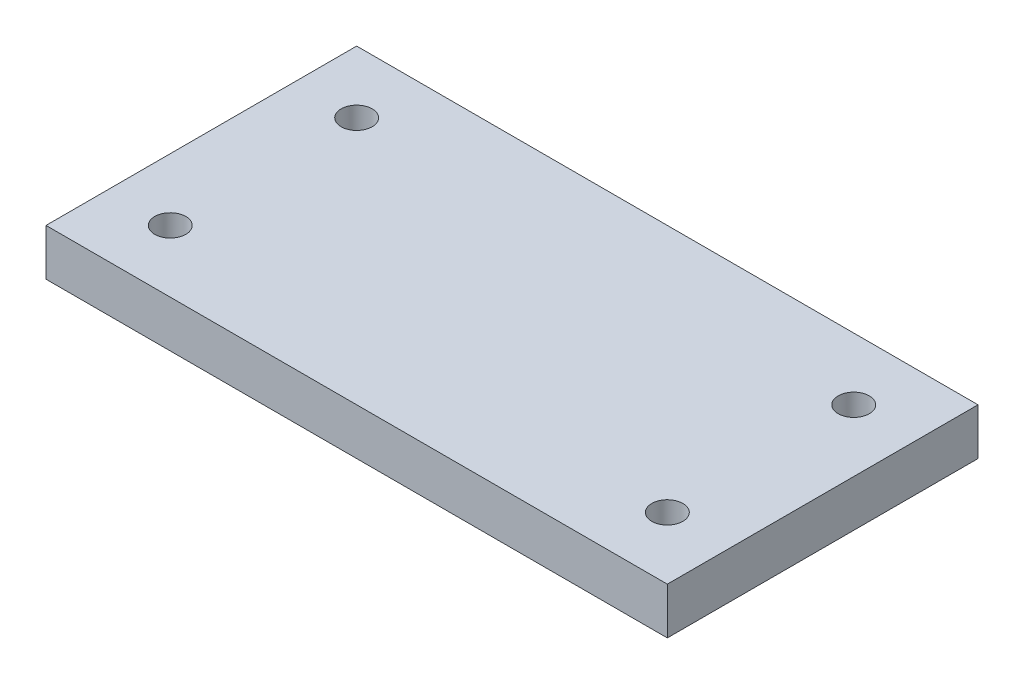
ISO-10303-21;
HEADER;
FILE_DESCRIPTION(('STEP AP214'),'2;1');
FILE_NAME('part.step','',(''),(''),'','','');
FILE_SCHEMA(('AUTOMOTIVE_DESIGN { 1 0 10303 214 1 1 1 1 }'));
ENDSEC;
DATA;
#1=APPLICATION_CONTEXT('core data for automotive mechanical design processes');
#2=APPLICATION_PROTOCOL_DEFINITION('international standard','automotive_design',2000,#1);
#3=PRODUCT_CONTEXT('',#1,'mechanical');
#4=PRODUCT('Part','Part','',(#3));
#5=PRODUCT_RELATED_PRODUCT_CATEGORY('part','',(#4));
#6=PRODUCT_DEFINITION_FORMATION('','',#4);
#7=PRODUCT_DEFINITION_CONTEXT('part definition',#1,'design');
#8=PRODUCT_DEFINITION('design','',#6,#7);
#9=PRODUCT_DEFINITION_SHAPE('','',#8);
#10=(LENGTH_UNIT() NAMED_UNIT(*) SI_UNIT(.MILLI.,.METRE.));
#11=(NAMED_UNIT(*) PLANE_ANGLE_UNIT() SI_UNIT($,.RADIAN.));
#12=(NAMED_UNIT(*) SI_UNIT($,.STERADIAN.) SOLID_ANGLE_UNIT());
#13=UNCERTAINTY_MEASURE_WITH_UNIT(LENGTH_MEASURE(1.E-05),#10,'distance_accuracy_value','');
#14=(GEOMETRIC_REPRESENTATION_CONTEXT(3) GLOBAL_UNCERTAINTY_ASSIGNED_CONTEXT((#13)) GLOBAL_UNIT_ASSIGNED_CONTEXT((#10,
#11,#12)) REPRESENTATION_CONTEXT('',''));
#15=CARTESIAN_POINT('',(0.,0.,0.));
#16=DIRECTION('',(0.,0.,1.));
#17=DIRECTION('',(1.,0.,0.));
#18=AXIS2_PLACEMENT_3D('',#15,#16,#17);
#19=CARTESIAN_POINT('',(100.,15.,50.));
#20=DIRECTION('',(-1.,0.,0.));
#21=DIRECTION('',(0.,0.,1.));
#22=AXIS2_PLACEMENT_3D('',#19,#20,#21);
#23=PLANE('',#22);
#24=DIRECTION('',(0.,0.,-1.));
#25=VECTOR('',#24,1.);
#26=CARTESIAN_POINT('',(100.,0.,50.));
#27=LINE('',#26,#25);
#28=CARTESIAN_POINT('',(100.,0.,50.));
#29=VERTEX_POINT('',#28);
#30=CARTESIAN_POINT('',(100.,0.,-50.));
#31=VERTEX_POINT('',#30);
#32=EDGE_CURVE('E102',#29,#31,#27,.T.);
#33=ORIENTED_EDGE('',*,*,#32,.T.);
#34=DIRECTION('',(0.,-1.,0.));
#35=VECTOR('',#34,1.);
#36=CARTESIAN_POINT('',(100.,15.,-50.));
#37=LINE('',#36,#35);
#38=CARTESIAN_POINT('',(100.,15.,-50.));
#39=VERTEX_POINT('',#38);
#40=EDGE_CURVE('E11',#39,#31,#37,.T.);
#41=ORIENTED_EDGE('',*,*,#40,.F.);
#42=DIRECTION('',(0.,0.,-1.));
#43=VECTOR('',#42,1.);
#44=CARTESIAN_POINT('',(100.,15.,50.));
#45=LINE('',#44,#43);
#46=CARTESIAN_POINT('',(100.,15.,50.));
#47=VERTEX_POINT('',#46);
#48=EDGE_CURVE('E90',#47,#39,#45,.T.);
#49=ORIENTED_EDGE('',*,*,#48,.F.);
#50=DIRECTION('',(0.,-1.,0.));
#51=VECTOR('',#50,1.);
#52=CARTESIAN_POINT('',(100.,15.,50.));
#53=LINE('',#52,#51);
#54=EDGE_CURVE('E98',#47,#29,#53,.T.);
#55=ORIENTED_EDGE('',*,*,#54,.T.);
#56=EDGE_LOOP('',(#33,#41,#49,#55));
#57=FACE_BOUND('',#56,.T.);
#58=ADVANCED_FACE('F39',(#57),#23,.F.);
#59=CARTESIAN_POINT('',(-100.,15.,-50.));
#60=DIRECTION('',(0.,0.,1.));
#61=DIRECTION('',(1.,0.,0.));
#62=AXIS2_PLACEMENT_3D('',#59,#60,#61);
#63=PLANE('',#62);
#64=DIRECTION('',(-1.,0.,0.));
#65=VECTOR('',#64,1.);
#66=CARTESIAN_POINT('',(-100.,0.,-50.));
#67=LINE('',#66,#65);
#68=CARTESIAN_POINT('',(-100.,0.,-50.));
#69=VERTEX_POINT('',#68);
#70=EDGE_CURVE('E94',#31,#69,#67,.T.);
#71=ORIENTED_EDGE('',*,*,#70,.T.);
#72=DIRECTION('',(0.,-1.,0.));
#73=VECTOR('',#72,1.);
#74=CARTESIAN_POINT('',(-100.,15.,-50.));
#75=LINE('',#74,#73);
#76=CARTESIAN_POINT('',(-100.,15.,-50.));
#77=VERTEX_POINT('',#76);
#78=EDGE_CURVE('E47',#77,#69,#75,.T.);
#79=ORIENTED_EDGE('',*,*,#78,.F.);
#80=DIRECTION('',(-1.,0.,0.));
#81=VECTOR('',#80,1.);
#82=CARTESIAN_POINT('',(-100.,15.,-50.));
#83=LINE('',#82,#81);
#84=EDGE_CURVE('E85',#39,#77,#83,.T.);
#85=ORIENTED_EDGE('',*,*,#84,.F.);
#86=ORIENTED_EDGE('',*,*,#40,.T.);
#87=EDGE_LOOP('',(#71,#79,#85,#86));
#88=FACE_BOUND('',#87,.T.);
#89=ADVANCED_FACE('F93',(#88),#63,.F.);
#90=CARTESIAN_POINT('',(-100.,15.,50.));
#91=DIRECTION('',(1.,0.,0.));
#92=DIRECTION('',(0.,0.,-1.));
#93=AXIS2_PLACEMENT_3D('',#90,#91,#92);
#94=PLANE('',#93);
#95=DIRECTION('',(0.,0.,1.));
#96=VECTOR('',#95,1.);
#97=CARTESIAN_POINT('',(-100.,0.,50.));
#98=LINE('',#97,#96);
#99=CARTESIAN_POINT('',(-100.,0.,50.));
#100=VERTEX_POINT('',#99);
#101=EDGE_CURVE('E72',#69,#100,#98,.T.);
#102=ORIENTED_EDGE('',*,*,#101,.T.);
#103=DIRECTION('',(0.,-1.,0.));
#104=VECTOR('',#103,1.);
#105=CARTESIAN_POINT('',(-100.,15.,50.));
#106=LINE('',#105,#104);
#107=CARTESIAN_POINT('',(-100.,15.,50.));
#108=VERTEX_POINT('',#107);
#109=EDGE_CURVE('E95',#108,#100,#106,.T.);
#110=ORIENTED_EDGE('',*,*,#109,.F.);
#111=DIRECTION('',(0.,0.,1.));
#112=VECTOR('',#111,1.);
#113=CARTESIAN_POINT('',(-100.,15.,50.));
#114=LINE('',#113,#112);
#115=EDGE_CURVE('E88',#77,#108,#114,.T.);
#116=ORIENTED_EDGE('',*,*,#115,.F.);
#117=ORIENTED_EDGE('',*,*,#78,.T.);
#118=EDGE_LOOP('',(#102,#110,#116,#117));
#119=FACE_BOUND('',#118,.T.);
#120=ADVANCED_FACE('F96',(#119),#94,.F.);
#121=CARTESIAN_POINT('',(-100.,15.,50.));
#122=DIRECTION('',(0.,0.,-1.));
#123=DIRECTION('',(-1.,0.,0.));
#124=AXIS2_PLACEMENT_3D('',#121,#122,#123);
#125=PLANE('',#124);
#126=DIRECTION('',(1.,0.,0.));
#127=VECTOR('',#126,1.);
#128=CARTESIAN_POINT('',(-100.,0.,50.));
#129=LINE('',#128,#127);
#130=EDGE_CURVE('E78',#100,#29,#129,.T.);
#131=ORIENTED_EDGE('',*,*,#130,.T.);
#132=ORIENTED_EDGE('',*,*,#54,.F.);
#133=DIRECTION('',(1.,0.,0.));
#134=VECTOR('',#133,1.);
#135=CARTESIAN_POINT('',(-100.,15.,50.));
#136=LINE('',#135,#134);
#137=EDGE_CURVE('E55',#108,#47,#136,.T.);
#138=ORIENTED_EDGE('',*,*,#137,.F.);
#139=ORIENTED_EDGE('',*,*,#109,.T.);
#140=EDGE_LOOP('',(#131,#132,#138,#139));
#141=FACE_BOUND('',#140,.T.);
#142=ADVANCED_FACE('F110',(#141),#125,.F.);
#143=CARTESIAN_POINT('',(0.,15.,0.));
#144=DIRECTION('',(0.,-1.,0.));
#145=DIRECTION('',(0.,0.,-1.));
#146=AXIS2_PLACEMENT_3D('',#143,#144,#145);
#147=PLANE('',#146);
#148=CARTESIAN_POINT('',(80.,15.,-30.));
#149=DIRECTION('',(0.,-1.,0.));
#150=DIRECTION('',(0.,0.,-1.));
#151=AXIS2_PLACEMENT_3D('',#148,#149,#150);
#152=CIRCLE('',#151,5.00000000000001);
#153=CARTESIAN_POINT('',(80.,15.,-35.));
#154=VERTEX_POINT('',#153);
#155=EDGE_CURVE('E131',#154,#154,#152,.F.);
#156=ORIENTED_EDGE('',*,*,#155,.F.);
#157=EDGE_LOOP('',(#156));
#158=FACE_BOUND('',#157,.T.);
#159=CARTESIAN_POINT('',(-80.,15.,-30.));
#160=DIRECTION('',(0.,-1.,0.));
#161=DIRECTION('',(0.,0.,-1.));
#162=AXIS2_PLACEMENT_3D('',#159,#160,#161);
#163=CIRCLE('',#162,5.00000000000001);
#164=CARTESIAN_POINT('',(-80.,15.,-35.));
#165=VERTEX_POINT('',#164);
#166=EDGE_CURVE('E105',#165,#165,#163,.F.);
#167=ORIENTED_EDGE('',*,*,#166,.F.);
#168=EDGE_LOOP('',(#167));
#169=FACE_BOUND('',#168,.T.);
#170=CARTESIAN_POINT('',(80.,15.,30.));
#171=DIRECTION('',(0.,-1.,0.));
#172=DIRECTION('',(0.,0.,-1.));
#173=AXIS2_PLACEMENT_3D('',#170,#171,#172);
#174=CIRCLE('',#173,5.);
#175=CARTESIAN_POINT('',(80.,15.,25.));
#176=VERTEX_POINT('',#175);
#177=EDGE_CURVE('E118',#176,#176,#174,.F.);
#178=ORIENTED_EDGE('',*,*,#177,.F.);
#179=EDGE_LOOP('',(#178));
#180=FACE_BOUND('',#179,.T.);
#181=CARTESIAN_POINT('',(-80.,15.,30.));
#182=DIRECTION('',(0.,-1.,0.));
#183=DIRECTION('',(0.,0.,-1.));
#184=AXIS2_PLACEMENT_3D('',#181,#182,#183);
#185=CIRCLE('',#184,5.);
#186=CARTESIAN_POINT('',(-80.,15.,25.));
#187=VERTEX_POINT('',#186);
#188=EDGE_CURVE('E121',#187,#187,#185,.F.);
#189=ORIENTED_EDGE('',*,*,#188,.F.);
#190=EDGE_LOOP('',(#189));
#191=FACE_BOUND('',#190,.T.);
#192=ORIENTED_EDGE('',*,*,#48,.T.);
#193=ORIENTED_EDGE('',*,*,#84,.T.);
#194=ORIENTED_EDGE('',*,*,#115,.T.);
#195=ORIENTED_EDGE('',*,*,#137,.T.);
#196=EDGE_LOOP('',(#192,#193,#194,#195));
#197=FACE_BOUND('',#196,.T.);
#198=ADVANCED_FACE('F86',(#158,#169,#180,#191,#197),#147,.F.);
#199=CARTESIAN_POINT('',(0.,0.,0.));
#200=DIRECTION('',(0.,-1.,0.));
#201=DIRECTION('',(0.,0.,-1.));
#202=AXIS2_PLACEMENT_3D('',#199,#200,#201);
#203=PLANE('',#202);
#204=CARTESIAN_POINT('',(80.,0.,-30.));
#205=DIRECTION('',(0.,1.,0.));
#206=DIRECTION('',(0.,0.,1.));
#207=AXIS2_PLACEMENT_3D('',#204,#205,#206);
#208=CIRCLE('',#207,5.00000000000001);
#209=CARTESIAN_POINT('',(80.,0.,-25.));
#210=VERTEX_POINT('',#209);
#211=EDGE_CURVE('E136',#210,#210,#208,.T.);
#212=ORIENTED_EDGE('',*,*,#211,.T.);
#213=EDGE_LOOP('',(#212));
#214=FACE_BOUND('',#213,.T.);
#215=CARTESIAN_POINT('',(-80.,0.,-30.));
#216=DIRECTION('',(0.,1.,0.));
#217=DIRECTION('',(0.,0.,1.));
#218=AXIS2_PLACEMENT_3D('',#215,#216,#217);
#219=CIRCLE('',#218,5.00000000000001);
#220=CARTESIAN_POINT('',(-80.,0.,-25.));
#221=VERTEX_POINT('',#220);
#222=EDGE_CURVE('E128',#221,#221,#219,.T.);
#223=ORIENTED_EDGE('',*,*,#222,.T.);
#224=EDGE_LOOP('',(#223));
#225=FACE_BOUND('',#224,.T.);
#226=CARTESIAN_POINT('',(80.,0.,30.));
#227=DIRECTION('',(0.,1.,0.));
#228=DIRECTION('',(0.,0.,1.));
#229=AXIS2_PLACEMENT_3D('',#226,#227,#228);
#230=CIRCLE('',#229,5.);
#231=CARTESIAN_POINT('',(80.,0.,35.));
#232=VERTEX_POINT('',#231);
#233=EDGE_CURVE('E127',#232,#232,#230,.T.);
#234=ORIENTED_EDGE('',*,*,#233,.T.);
#235=EDGE_LOOP('',(#234));
#236=FACE_BOUND('',#235,.T.);
#237=CARTESIAN_POINT('',(-80.,0.,30.));
#238=DIRECTION('',(0.,1.,0.));
#239=DIRECTION('',(0.,0.,1.));
#240=AXIS2_PLACEMENT_3D('',#237,#238,#239);
#241=CIRCLE('',#240,5.);
#242=CARTESIAN_POINT('',(-80.,0.,35.));
#243=VERTEX_POINT('',#242);
#244=EDGE_CURVE('E124',#243,#243,#241,.T.);
#245=ORIENTED_EDGE('',*,*,#244,.T.);
#246=EDGE_LOOP('',(#245));
#247=FACE_BOUND('',#246,.T.);
#248=ORIENTED_EDGE('',*,*,#32,.F.);
#249=ORIENTED_EDGE('',*,*,#130,.F.);
#250=ORIENTED_EDGE('',*,*,#101,.F.);
#251=ORIENTED_EDGE('',*,*,#70,.F.);
#252=EDGE_LOOP('',(#248,#249,#250,#251));
#253=FACE_BOUND('',#252,.T.);
#254=ADVANCED_FACE('F113',(#214,#225,#236,#247,#253),#203,.T.);
#255=CARTESIAN_POINT('',(-80.,30.,30.));
#256=DIRECTION('',(0.,-1.,0.));
#257=DIRECTION('',(0.,0.,-1.));
#258=AXIS2_PLACEMENT_3D('',#255,#256,#257);
#259=CYLINDRICAL_SURFACE('',#258,5.);
#260=ORIENTED_EDGE('',*,*,#244,.F.);
#261=EDGE_LOOP('',(#260));
#262=FACE_BOUND('',#261,.T.);
#263=ORIENTED_EDGE('',*,*,#188,.T.);
#264=EDGE_LOOP('',(#263));
#265=FACE_BOUND('',#264,.T.);
#266=ADVANCED_FACE('F158',(#262,#265),#259,.F.);
#267=CARTESIAN_POINT('',(80.,30.,30.));
#268=DIRECTION('',(0.,-1.,0.));
#269=DIRECTION('',(0.,0.,-1.));
#270=AXIS2_PLACEMENT_3D('',#267,#268,#269);
#271=CYLINDRICAL_SURFACE('',#270,5.);
#272=ORIENTED_EDGE('',*,*,#233,.F.);
#273=EDGE_LOOP('',(#272));
#274=FACE_BOUND('',#273,.T.);
#275=ORIENTED_EDGE('',*,*,#177,.T.);
#276=EDGE_LOOP('',(#275));
#277=FACE_BOUND('',#276,.T.);
#278=ADVANCED_FACE('F160',(#274,#277),#271,.F.);
#279=CARTESIAN_POINT('',(-80.,30.,-30.));
#280=DIRECTION('',(0.,-1.,0.));
#281=DIRECTION('',(0.,0.,-1.));
#282=AXIS2_PLACEMENT_3D('',#279,#280,#281);
#283=CYLINDRICAL_SURFACE('',#282,5.00000000000001);
#284=ORIENTED_EDGE('',*,*,#222,.F.);
#285=EDGE_LOOP('',(#284));
#286=FACE_BOUND('',#285,.T.);
#287=ORIENTED_EDGE('',*,*,#166,.T.);
#288=EDGE_LOOP('',(#287));
#289=FACE_BOUND('',#288,.T.);
#290=ADVANCED_FACE('F145',(#286,#289),#283,.F.);
#291=CARTESIAN_POINT('',(80.,30.,-30.));
#292=DIRECTION('',(0.,-1.,0.));
#293=DIRECTION('',(0.,0.,-1.));
#294=AXIS2_PLACEMENT_3D('',#291,#292,#293);
#295=CYLINDRICAL_SURFACE('',#294,5.00000000000001);
#296=ORIENTED_EDGE('',*,*,#211,.F.);
#297=EDGE_LOOP('',(#296));
#298=FACE_BOUND('',#297,.T.);
#299=ORIENTED_EDGE('',*,*,#155,.T.);
#300=EDGE_LOOP('',(#299));
#301=FACE_BOUND('',#300,.T.);
#302=ADVANCED_FACE('F142',(#298,#301),#295,.F.);
#303=CLOSED_SHELL('',(#58,#89,#120,#142,#198,#254,#266,#278,#290,#302));
#304=MANIFOLD_SOLID_BREP('B2',#303);
#305=ADVANCED_BREP_SHAPE_REPRESENTATION('',(#18,#304),#14);
#306=SHAPE_DEFINITION_REPRESENTATION(#9,#305);
ENDSEC;
END-ISO-10303-21;
